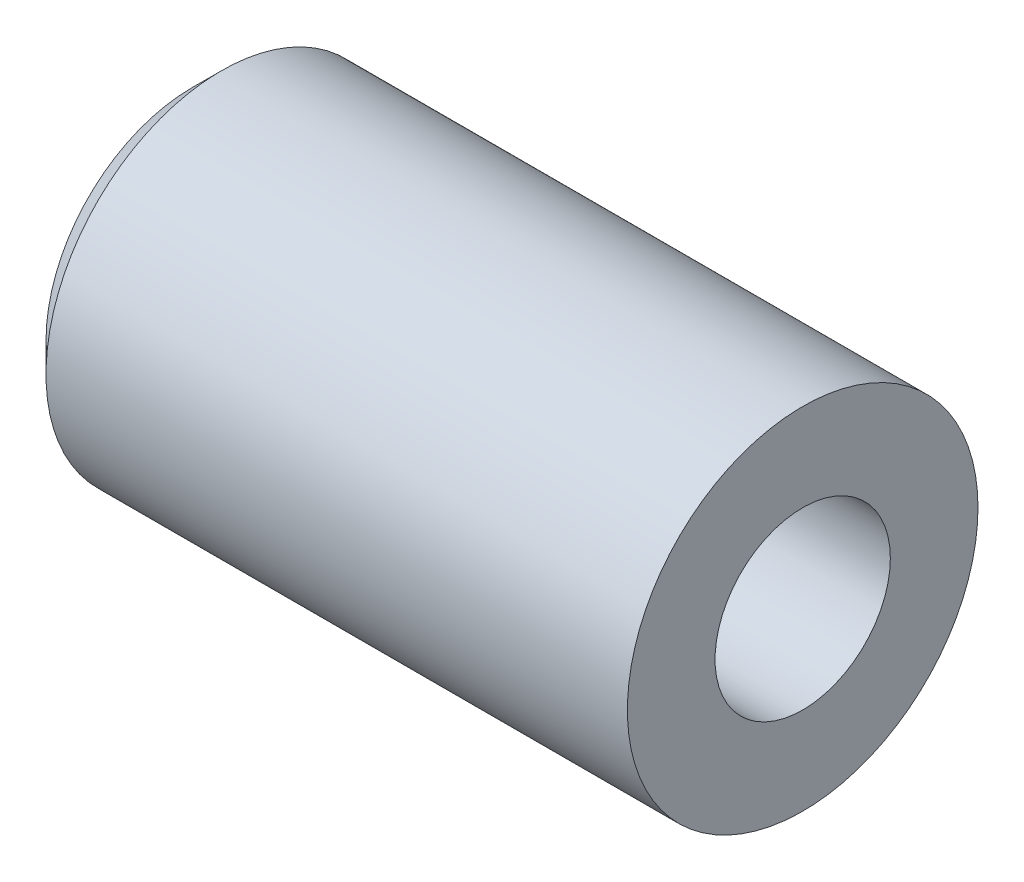
ISO-10303-21;
HEADER;
FILE_DESCRIPTION(('STEP AP214'),'2;1');
FILE_NAME('part.step','',(''),(''),'','','');
FILE_SCHEMA(('AUTOMOTIVE_DESIGN { 1 0 10303 214 1 1 1 1 }'));
ENDSEC;
DATA;
#1=APPLICATION_CONTEXT('core data for automotive mechanical design processes');
#2=APPLICATION_PROTOCOL_DEFINITION('international standard','automotive_design',2000,#1);
#3=PRODUCT_CONTEXT('',#1,'mechanical');
#4=PRODUCT('Part','Part','',(#3));
#5=PRODUCT_RELATED_PRODUCT_CATEGORY('part','',(#4));
#6=PRODUCT_DEFINITION_FORMATION('','',#4);
#7=PRODUCT_DEFINITION_CONTEXT('part definition',#1,'design');
#8=PRODUCT_DEFINITION('design','',#6,#7);
#9=PRODUCT_DEFINITION_SHAPE('','',#8);
#10=(LENGTH_UNIT() NAMED_UNIT(*) SI_UNIT(.MILLI.,.METRE.));
#11=(NAMED_UNIT(*) PLANE_ANGLE_UNIT() SI_UNIT($,.RADIAN.));
#12=(NAMED_UNIT(*) SI_UNIT($,.STERADIAN.) SOLID_ANGLE_UNIT());
#13=UNCERTAINTY_MEASURE_WITH_UNIT(LENGTH_MEASURE(1.E-05),#10,'distance_accuracy_value','');
#14=(GEOMETRIC_REPRESENTATION_CONTEXT(3) GLOBAL_UNCERTAINTY_ASSIGNED_CONTEXT((#13)) GLOBAL_UNIT_ASSIGNED_CONTEXT((#10,
#11,#12)) REPRESENTATION_CONTEXT('',''));
#15=CARTESIAN_POINT('',(0.,0.,0.));
#16=DIRECTION('',(0.,0.,1.));
#17=DIRECTION('',(1.,0.,0.));
#18=AXIS2_PLACEMENT_3D('',#15,#16,#17);
#19=CARTESIAN_POINT('',(20.9,0.,0.));
#20=DIRECTION('',(1.,0.,0.));
#21=DIRECTION('',(0.,0.,-1.));
#22=AXIS2_PLACEMENT_3D('',#19,#20,#21);
#23=PLANE('',#22);
#24=CARTESIAN_POINT('',(20.9,0.,0.));
#25=DIRECTION('',(1.,0.,0.));
#26=DIRECTION('',(0.,0.,-1.));
#27=AXIS2_PLACEMENT_3D('',#24,#25,#26);
#28=CIRCLE('',#27,6.);
#29=CARTESIAN_POINT('',(20.9,0.,-6.));
#30=VERTEX_POINT('',#29);
#31=EDGE_CURVE('E46',#30,#30,#28,.T.);
#32=ORIENTED_EDGE('',*,*,#31,.T.);
#33=EDGE_LOOP('',(#32));
#34=FACE_BOUND('',#33,.T.);
#35=CARTESIAN_POINT('',(20.9,0.,0.));
#36=DIRECTION('',(1.,0.,0.));
#37=DIRECTION('',(0.,0.,-1.));
#38=AXIS2_PLACEMENT_3D('',#35,#36,#37);
#39=CIRCLE('',#38,3.);
#40=CARTESIAN_POINT('',(20.9,0.,-3.));
#41=VERTEX_POINT('',#40);
#42=EDGE_CURVE('E50',#41,#41,#39,.T.);
#43=ORIENTED_EDGE('',*,*,#42,.F.);
#44=EDGE_LOOP('',(#43));
#45=FACE_BOUND('',#44,.T.);
#46=ADVANCED_FACE('F35',(#34,#45),#23,.T.);
#47=CARTESIAN_POINT('',(0.,0.,0.));
#48=DIRECTION('',(1.,0.,0.));
#49=DIRECTION('',(0.,0.,-1.));
#50=AXIS2_PLACEMENT_3D('',#47,#48,#49);
#51=PLANE('',#50);
#52=CARTESIAN_POINT('',(0.,0.,0.));
#53=DIRECTION('',(1.,0.,0.));
#54=DIRECTION('',(0.,0.,-1.));
#55=AXIS2_PLACEMENT_3D('',#52,#53,#54);
#56=CIRCLE('',#55,4.99999999999999);
#57=CARTESIAN_POINT('',(0.,0.,-4.99999999999999));
#58=VERTEX_POINT('',#57);
#59=EDGE_CURVE('E10',#58,#58,#56,.F.);
#60=ORIENTED_EDGE('',*,*,#59,.T.);
#61=EDGE_LOOP('',(#60));
#62=FACE_BOUND('',#61,.T.);
#63=CARTESIAN_POINT('',(0.,0.,0.));
#64=DIRECTION('',(1.,0.,0.));
#65=DIRECTION('',(0.,0.,-1.));
#66=AXIS2_PLACEMENT_3D('',#63,#64,#65);
#67=CIRCLE('',#66,3.);
#68=CARTESIAN_POINT('',(0.,0.,-3.));
#69=VERTEX_POINT('',#68);
#70=EDGE_CURVE('E53',#69,#69,#67,.T.);
#71=ORIENTED_EDGE('',*,*,#70,.T.);
#72=EDGE_LOOP('',(#71));
#73=FACE_BOUND('',#72,.T.);
#74=ADVANCED_FACE('F63',(#62,#73),#51,.F.);
#75=CARTESIAN_POINT('',(20.9,0.,0.));
#76=DIRECTION('',(-1.,0.,0.));
#77=DIRECTION('',(0.,0.,1.));
#78=AXIS2_PLACEMENT_3D('',#75,#76,#77);
#79=CYLINDRICAL_SURFACE('',#78,6.);
#80=CARTESIAN_POINT('',(1.,0.,0.));
#81=DIRECTION('',(1.,0.,0.));
#82=DIRECTION('',(0.,0.,-1.));
#83=AXIS2_PLACEMENT_3D('',#80,#81,#82);
#84=CIRCLE('',#83,6.);
#85=CARTESIAN_POINT('',(1.,0.,-6.));
#86=VERTEX_POINT('',#85);
#87=EDGE_CURVE('E42',#86,#86,#84,.T.);
#88=ORIENTED_EDGE('',*,*,#87,.T.);
#89=EDGE_LOOP('',(#88));
#90=FACE_BOUND('',#89,.T.);
#91=ORIENTED_EDGE('',*,*,#31,.F.);
#92=EDGE_LOOP('',(#91));
#93=FACE_BOUND('',#92,.T.);
#94=ADVANCED_FACE('F69',(#90,#93),#79,.T.);
#95=CARTESIAN_POINT('',(20.9,0.,0.));
#96=DIRECTION('',(-1.,0.,0.));
#97=DIRECTION('',(0.,0.,1.));
#98=AXIS2_PLACEMENT_3D('',#95,#96,#97);
#99=CYLINDRICAL_SURFACE('',#98,3.);
#100=ORIENTED_EDGE('',*,*,#42,.T.);
#101=EDGE_LOOP('',(#100));
#102=FACE_BOUND('',#101,.T.);
#103=ORIENTED_EDGE('',*,*,#70,.F.);
#104=EDGE_LOOP('',(#103));
#105=FACE_BOUND('',#104,.T.);
#106=ADVANCED_FACE('F59',(#102,#105),#99,.F.);
#107=CARTESIAN_POINT('',(1.,0.,0.));
#108=DIRECTION('',(1.,0.,0.));
#109=DIRECTION('',(0.,0.,-1.));
#110=AXIS2_PLACEMENT_3D('',#107,#108,#109);
#111=CONICAL_SURFACE('',#110,6.,0.78539816339745);
#112=ORIENTED_EDGE('',*,*,#59,.F.);
#113=EDGE_LOOP('',(#112));
#114=FACE_BOUND('',#113,.T.);
#115=ORIENTED_EDGE('',*,*,#87,.F.);
#116=EDGE_LOOP('',(#115));
#117=FACE_BOUND('',#116,.T.);
#118=ADVANCED_FACE('F37',(#114,#117),#111,.T.);
#119=CLOSED_SHELL('',(#46,#74,#94,#106,#118));
#120=MANIFOLD_SOLID_BREP('B2',#119);
#121=ADVANCED_BREP_SHAPE_REPRESENTATION('',(#18,#120),#14);
#122=SHAPE_DEFINITION_REPRESENTATION(#9,#121);
ENDSEC;
END-ISO-10303-21;
